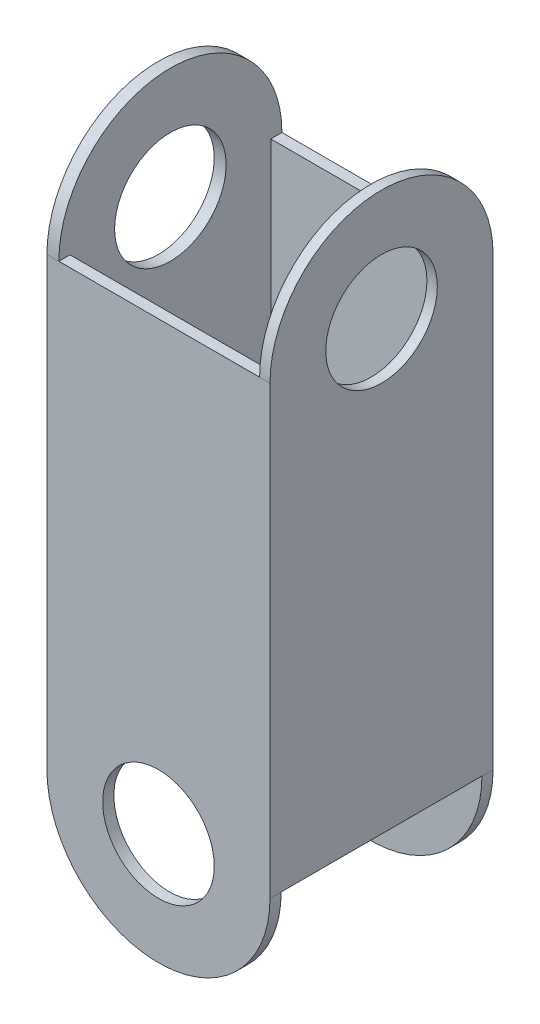
ISO-10303-21;
HEADER;
FILE_DESCRIPTION(('STEP AP214'),'2;1');
FILE_NAME('part.step','',(''),(''),'','','');
FILE_SCHEMA(('AUTOMOTIVE_DESIGN { 1 0 10303 214 1 1 1 1 }'));
ENDSEC;
DATA;
#1=APPLICATION_CONTEXT('core data for automotive mechanical design processes');
#2=APPLICATION_PROTOCOL_DEFINITION('international standard','automotive_design',2000,#1);
#3=PRODUCT_CONTEXT('',#1,'mechanical');
#4=PRODUCT('Part','Part','',(#3));
#5=PRODUCT_RELATED_PRODUCT_CATEGORY('part','',(#4));
#6=PRODUCT_DEFINITION_FORMATION('','',#4);
#7=PRODUCT_DEFINITION_CONTEXT('part definition',#1,'design');
#8=PRODUCT_DEFINITION('design','',#6,#7);
#9=PRODUCT_DEFINITION_SHAPE('','',#8);
#10=(LENGTH_UNIT() NAMED_UNIT(*) SI_UNIT(.MILLI.,.METRE.));
#11=(NAMED_UNIT(*) PLANE_ANGLE_UNIT() SI_UNIT($,.RADIAN.));
#12=(NAMED_UNIT(*) SI_UNIT($,.STERADIAN.) SOLID_ANGLE_UNIT());
#13=UNCERTAINTY_MEASURE_WITH_UNIT(LENGTH_MEASURE(1.E-05),#10,'distance_accuracy_value','');
#14=(GEOMETRIC_REPRESENTATION_CONTEXT(3) GLOBAL_UNCERTAINTY_ASSIGNED_CONTEXT((#13)) GLOBAL_UNIT_ASSIGNED_CONTEXT((#10,
#11,#12)) REPRESENTATION_CONTEXT('',''));
#15=CARTESIAN_POINT('',(0.,0.,0.));
#16=DIRECTION('',(0.,0.,1.));
#17=DIRECTION('',(1.,0.,0.));
#18=AXIS2_PLACEMENT_3D('',#15,#16,#17);
#19=CARTESIAN_POINT('',(20.,20.,10.));
#20=DIRECTION('',(0.,-1.,0.));
#21=DIRECTION('',(0.,0.,-1.));
#22=AXIS2_PLACEMENT_3D('',#19,#20,#21);
#23=PLANE('',#22);
#24=DIRECTION('',(0.,0.,-1.));
#25=VECTOR('',#24,1.);
#26=CARTESIAN_POINT('',(1.06806667440152,20.,10.));
#27=LINE('',#26,#25);
#28=CARTESIAN_POINT('',(1.06806667440152,20.,10.));
#29=VERTEX_POINT('',#28);
#30=CARTESIAN_POINT('',(1.06806667440152,20.,9.));
#31=VERTEX_POINT('',#30);
#32=EDGE_CURVE('E167',#29,#31,#27,.T.);
#33=ORIENTED_EDGE('',*,*,#32,.F.);
#34=DIRECTION('',(-1.,0.,0.));
#35=VECTOR('',#34,1.);
#36=CARTESIAN_POINT('',(20.,20.,10.));
#37=LINE('',#36,#35);
#38=CARTESIAN_POINT('',(19.0680666744015,20.,10.));
#39=VERTEX_POINT('',#38);
#40=EDGE_CURVE('E180',#39,#29,#37,.T.);
#41=ORIENTED_EDGE('',*,*,#40,.F.);
#42=DIRECTION('',(0.,0.,1.));
#43=VECTOR('',#42,1.);
#44=CARTESIAN_POINT('',(19.0680666744015,20.,10.));
#45=LINE('',#44,#43);
#46=CARTESIAN_POINT('',(19.0680666744015,20.,9.));
#47=VERTEX_POINT('',#46);
#48=EDGE_CURVE('E219',#47,#39,#45,.T.);
#49=ORIENTED_EDGE('',*,*,#48,.F.);
#50=DIRECTION('',(1.,0.,0.));
#51=VECTOR('',#50,1.);
#52=CARTESIAN_POINT('',(1.06806667440152,20.,9.));
#53=LINE('',#52,#51);
#54=EDGE_CURVE('E183',#31,#47,#53,.T.);
#55=ORIENTED_EDGE('',*,*,#54,.F.);
#56=EDGE_LOOP('',(#33,#41,#49,#55));
#57=FACE_BOUND('',#56,.T.);
#58=ADVANCED_FACE('F39',(#57),#23,.F.);
#59=CARTESIAN_POINT('',(1.06806667440152,20.,-9.));
#60=VERTEX_POINT('',#59);
#61=CARTESIAN_POINT('',(1.06806667440152,20.,-10.));
#62=VERTEX_POINT('',#61);
#63=EDGE_CURVE('E175',#60,#62,#27,.T.);
#64=ORIENTED_EDGE('',*,*,#63,.F.);
#65=DIRECTION('',(-1.,0.,0.));
#66=VECTOR('',#65,1.);
#67=CARTESIAN_POINT('',(1.06806667440152,20.,-9.));
#68=LINE('',#67,#66);
#69=CARTESIAN_POINT('',(19.0680666744015,20.,-9.));
#70=VERTEX_POINT('',#69);
#71=EDGE_CURVE('E223',#70,#60,#68,.T.);
#72=ORIENTED_EDGE('',*,*,#71,.F.);
#73=CARTESIAN_POINT('',(19.0680666744015,20.,-10.));
#74=VERTEX_POINT('',#73);
#75=EDGE_CURVE('E56',#74,#70,#45,.T.);
#76=ORIENTED_EDGE('',*,*,#75,.F.);
#77=DIRECTION('',(-1.,0.,0.));
#78=VECTOR('',#77,1.);
#79=CARTESIAN_POINT('',(20.,20.,-10.));
#80=LINE('',#79,#78);
#81=EDGE_CURVE('E48',#74,#62,#80,.T.);
#82=ORIENTED_EDGE('',*,*,#81,.T.);
#83=EDGE_LOOP('',(#64,#72,#76,#82));
#84=FACE_BOUND('',#83,.T.);
#85=ADVANCED_FACE('F362',(#84),#23,.F.);
#86=CARTESIAN_POINT('',(20.,-20.,10.));
#87=DIRECTION('',(0.,1.,0.));
#88=DIRECTION('',(0.,0.,1.));
#89=AXIS2_PLACEMENT_3D('',#86,#87,#88);
#90=PLANE('',#89);
#91=DIRECTION('',(-1.,0.,0.));
#92=VECTOR('',#91,1.);
#93=CARTESIAN_POINT('',(20.,-20.,-9.));
#94=LINE('',#93,#92);
#95=CARTESIAN_POINT('',(20.,-20.,-9.));
#96=VERTEX_POINT('',#95);
#97=CARTESIAN_POINT('',(18.9659666627992,-20.,-9.));
#98=VERTEX_POINT('',#97);
#99=EDGE_CURVE('E262',#96,#98,#94,.T.);
#100=ORIENTED_EDGE('',*,*,#99,.F.);
#101=DIRECTION('',(0.,0.,-1.));
#102=VECTOR('',#101,1.);
#103=CARTESIAN_POINT('',(20.,-20.,10.));
#104=LINE('',#103,#102);
#105=CARTESIAN_POINT('',(20.,-20.,9.));
#106=VERTEX_POINT('',#105);
#107=EDGE_CURVE('E191',#106,#96,#104,.T.);
#108=ORIENTED_EDGE('',*,*,#107,.F.);
#109=DIRECTION('',(1.,0.,0.));
#110=VECTOR('',#109,1.);
#111=CARTESIAN_POINT('',(20.,-20.,9.));
#112=LINE('',#111,#110);
#113=CARTESIAN_POINT('',(18.9659666627992,-20.,9.));
#114=VERTEX_POINT('',#113);
#115=EDGE_CURVE('E273',#114,#106,#112,.T.);
#116=ORIENTED_EDGE('',*,*,#115,.F.);
#117=DIRECTION('',(0.,0.,1.));
#118=VECTOR('',#117,1.);
#119=CARTESIAN_POINT('',(18.9659666627992,-20.,9.));
#120=LINE('',#119,#118);
#121=EDGE_CURVE('E279',#98,#114,#120,.T.);
#122=ORIENTED_EDGE('',*,*,#121,.F.);
#123=EDGE_LOOP('',(#100,#108,#116,#122));
#124=FACE_BOUND('',#123,.T.);
#125=ADVANCED_FACE('F333',(#124),#90,.F.);
#126=CARTESIAN_POINT('',(0.965966662799245,-20.,-9.));
#127=VERTEX_POINT('',#126);
#128=CARTESIAN_POINT('',(0.,-20.,-9.));
#129=VERTEX_POINT('',#128);
#130=EDGE_CURVE('E257',#127,#129,#94,.T.);
#131=ORIENTED_EDGE('',*,*,#130,.F.);
#132=DIRECTION('',(0.,0.,-1.));
#133=VECTOR('',#132,1.);
#134=CARTESIAN_POINT('',(0.965966662799243,-20.,9.));
#135=LINE('',#134,#133);
#136=CARTESIAN_POINT('',(0.965966662799243,-20.,9.));
#137=VERTEX_POINT('',#136);
#138=EDGE_CURVE('E284',#137,#127,#135,.T.);
#139=ORIENTED_EDGE('',*,*,#138,.F.);
#140=CARTESIAN_POINT('',(0.,-20.,9.));
#141=VERTEX_POINT('',#140);
#142=EDGE_CURVE('E276',#141,#137,#112,.T.);
#143=ORIENTED_EDGE('',*,*,#142,.F.);
#144=DIRECTION('',(0.,0.,-1.));
#145=VECTOR('',#144,1.);
#146=CARTESIAN_POINT('',(0.,-20.,10.));
#147=LINE('',#146,#145);
#148=EDGE_CURVE('E312',#141,#129,#147,.T.);
#149=ORIENTED_EDGE('',*,*,#148,.T.);
#150=EDGE_LOOP('',(#131,#139,#143,#149));
#151=FACE_BOUND('',#150,.T.);
#152=ADVANCED_FACE('F390',(#151),#90,.F.);
#153=CARTESIAN_POINT('',(20.,20.,-10.));
#154=DIRECTION('',(0.,0.,1.));
#155=DIRECTION('',(0.,-1.,0.));
#156=AXIS2_PLACEMENT_3D('',#153,#154,#155);
#157=PLANE('',#156);
#158=CARTESIAN_POINT('',(10.,-20.,-10.));
#159=DIRECTION('',(0.,0.,-1.));
#160=DIRECTION('',(0.,1.,0.));
#161=AXIS2_PLACEMENT_3D('',#158,#159,#160);
#162=CIRCLE('',#161,5.);
#163=CARTESIAN_POINT('',(10.,-15.,-10.));
#164=VERTEX_POINT('',#163);
#165=EDGE_CURVE('E242',#164,#164,#162,.T.);
#166=ORIENTED_EDGE('',*,*,#165,.F.);
#167=EDGE_LOOP('',(#166));
#168=FACE_BOUND('',#167,.T.);
#169=DIRECTION('',(0.,1.,0.));
#170=VECTOR('',#169,1.);
#171=CARTESIAN_POINT('',(20.,20.,-10.));
#172=LINE('',#171,#170);
#173=CARTESIAN_POINT('',(20.,-20.,-10.));
#174=VERTEX_POINT('',#173);
#175=CARTESIAN_POINT('',(20.,20.,-10.));
#176=VERTEX_POINT('',#175);
#177=EDGE_CURVE('E306',#174,#176,#172,.T.);
#178=ORIENTED_EDGE('',*,*,#177,.F.);
#179=CARTESIAN_POINT('',(10.,-20.,-10.));
#180=DIRECTION('',(0.,0.,-1.));
#181=DIRECTION('',(0.,1.,0.));
#182=AXIS2_PLACEMENT_3D('',#179,#180,#181);
#183=CIRCLE('',#182,10.);
#184=CARTESIAN_POINT('',(0.,-20.,-10.));
#185=VERTEX_POINT('',#184);
#186=EDGE_CURVE('E251',#174,#185,#183,.T.);
#187=ORIENTED_EDGE('',*,*,#186,.T.);
#188=DIRECTION('',(0.,1.,0.));
#189=VECTOR('',#188,1.);
#190=CARTESIAN_POINT('',(0.,20.,-10.));
#191=LINE('',#190,#189);
#192=CARTESIAN_POINT('',(0.,20.,-10.));
#193=VERTEX_POINT('',#192);
#194=EDGE_CURVE('E300',#185,#193,#191,.T.);
#195=ORIENTED_EDGE('',*,*,#194,.T.);
#196=DIRECTION('',(-1.,0.,0.));
#197=VECTOR('',#196,1.);
#198=CARTESIAN_POINT('',(1.06806667440152,20.,-10.));
#199=LINE('',#198,#197);
#200=EDGE_CURVE('E166',#62,#193,#199,.T.);
#201=ORIENTED_EDGE('',*,*,#200,.F.);
#202=ORIENTED_EDGE('',*,*,#81,.F.);
#203=EDGE_CURVE('E11',#176,#74,#80,.T.);
#204=ORIENTED_EDGE('',*,*,#203,.F.);
#205=EDGE_LOOP('',(#178,#187,#195,#201,#202,#204));
#206=FACE_BOUND('',#205,.T.);
#207=ADVANCED_FACE('F41',(#168,#206),#157,.F.);
#208=CARTESIAN_POINT('',(20.,20.,10.));
#209=DIRECTION('',(0.,0.,-1.));
#210=DIRECTION('',(0.,1.,0.));
#211=AXIS2_PLACEMENT_3D('',#208,#209,#210);
#212=PLANE('',#211);
#213=CARTESIAN_POINT('',(10.,-20.,10.));
#214=DIRECTION('',(0.,0.,1.));
#215=DIRECTION('',(1.,0.,0.));
#216=AXIS2_PLACEMENT_3D('',#213,#214,#215);
#217=CIRCLE('',#216,5.);
#218=CARTESIAN_POINT('',(15.,-20.,10.));
#219=VERTEX_POINT('',#218);
#220=EDGE_CURVE('E207',#219,#219,#217,.T.);
#221=ORIENTED_EDGE('',*,*,#220,.F.);
#222=EDGE_LOOP('',(#221));
#223=FACE_BOUND('',#222,.T.);
#224=DIRECTION('',(0.,-1.,0.));
#225=VECTOR('',#224,1.);
#226=CARTESIAN_POINT('',(0.,20.,10.));
#227=LINE('',#226,#225);
#228=CARTESIAN_POINT('',(0.,20.,10.));
#229=VERTEX_POINT('',#228);
#230=CARTESIAN_POINT('',(0.,-20.,10.));
#231=VERTEX_POINT('',#230);
#232=EDGE_CURVE('E311',#229,#231,#227,.T.);
#233=ORIENTED_EDGE('',*,*,#232,.T.);
#234=CARTESIAN_POINT('',(10.,-20.,10.));
#235=DIRECTION('',(0.,0.,1.));
#236=DIRECTION('',(1.,0.,0.));
#237=AXIS2_PLACEMENT_3D('',#234,#235,#236);
#238=CIRCLE('',#237,10.);
#239=CARTESIAN_POINT('',(20.,-20.,10.));
#240=VERTEX_POINT('',#239);
#241=EDGE_CURVE('E269',#231,#240,#238,.T.);
#242=ORIENTED_EDGE('',*,*,#241,.T.);
#243=DIRECTION('',(0.,-1.,0.));
#244=VECTOR('',#243,1.);
#245=CARTESIAN_POINT('',(20.,20.,10.));
#246=LINE('',#245,#244);
#247=CARTESIAN_POINT('',(20.,20.,10.));
#248=VERTEX_POINT('',#247);
#249=EDGE_CURVE('E308',#248,#240,#246,.T.);
#250=ORIENTED_EDGE('',*,*,#249,.F.);
#251=EDGE_CURVE('E187',#248,#39,#37,.T.);
#252=ORIENTED_EDGE('',*,*,#251,.T.);
#253=ORIENTED_EDGE('',*,*,#40,.T.);
#254=DIRECTION('',(-1.,0.,0.));
#255=VECTOR('',#254,1.);
#256=CARTESIAN_POINT('',(1.06806667440152,20.,10.));
#257=LINE('',#256,#255);
#258=EDGE_CURVE('E156',#29,#229,#257,.T.);
#259=ORIENTED_EDGE('',*,*,#258,.T.);
#260=EDGE_LOOP('',(#233,#242,#250,#252,#253,#259));
#261=FACE_BOUND('',#260,.T.);
#262=ADVANCED_FACE('F185',(#223,#261),#212,.F.);
#263=CARTESIAN_POINT('',(20.,0.,0.));
#264=DIRECTION('',(1.,0.,0.));
#265=DIRECTION('',(0.,0.,-1.));
#266=AXIS2_PLACEMENT_3D('',#263,#264,#265);
#267=PLANE('',#266);
#268=CARTESIAN_POINT('',(20.,20.,0.));
#269=DIRECTION('',(1.,0.,0.));
#270=DIRECTION('',(0.,0.,-1.));
#271=AXIS2_PLACEMENT_3D('',#268,#269,#270);
#272=CIRCLE('',#271,5.);
#273=CARTESIAN_POINT('',(20.,20.,-5.));
#274=VERTEX_POINT('',#273);
#275=EDGE_CURVE('E211',#274,#274,#272,.T.);
#276=ORIENTED_EDGE('',*,*,#275,.F.);
#277=EDGE_LOOP('',(#276));
#278=FACE_BOUND('',#277,.T.);
#279=ORIENTED_EDGE('',*,*,#177,.T.);
#280=CARTESIAN_POINT('',(20.,20.,0.));
#281=DIRECTION('',(1.,0.,0.));
#282=DIRECTION('',(0.,0.,-1.));
#283=AXIS2_PLACEMENT_3D('',#280,#281,#282);
#284=CIRCLE('',#283,10.);
#285=EDGE_CURVE('E215',#176,#248,#284,.T.);
#286=ORIENTED_EDGE('',*,*,#285,.T.);
#287=ORIENTED_EDGE('',*,*,#249,.T.);
#288=EDGE_CURVE('E188',#240,#106,#104,.T.);
#289=ORIENTED_EDGE('',*,*,#288,.T.);
#290=ORIENTED_EDGE('',*,*,#107,.T.);
#291=DIRECTION('',(0.,0.,-1.));
#292=VECTOR('',#291,1.);
#293=CARTESIAN_POINT('',(20.,-20.,-9.));
#294=LINE('',#293,#292);
#295=EDGE_CURVE('E266',#96,#174,#294,.T.);
#296=ORIENTED_EDGE('',*,*,#295,.T.);
#297=EDGE_LOOP('',(#279,#286,#287,#289,#290,#296));
#298=FACE_BOUND('',#297,.T.);
#299=ADVANCED_FACE('F344',(#278,#298),#267,.T.);
#300=CARTESIAN_POINT('',(0.,0.,0.));
#301=DIRECTION('',(1.,0.,0.));
#302=DIRECTION('',(0.,0.,-1.));
#303=AXIS2_PLACEMENT_3D('',#300,#301,#302);
#304=PLANE('',#303);
#305=CARTESIAN_POINT('',(0.,20.,0.));
#306=DIRECTION('',(-1.,0.,0.));
#307=DIRECTION('',(0.,0.,1.));
#308=AXIS2_PLACEMENT_3D('',#305,#306,#307);
#309=CIRCLE('',#308,5.);
#310=CARTESIAN_POINT('',(0.,20.,5.));
#311=VERTEX_POINT('',#310);
#312=EDGE_CURVE('E198',#311,#311,#309,.T.);
#313=ORIENTED_EDGE('',*,*,#312,.F.);
#314=EDGE_LOOP('',(#313));
#315=FACE_BOUND('',#314,.T.);
#316=ORIENTED_EDGE('',*,*,#232,.F.);
#317=CARTESIAN_POINT('',(0.,20.,0.));
#318=DIRECTION('',(-1.,0.,0.));
#319=DIRECTION('',(0.,0.,1.));
#320=AXIS2_PLACEMENT_3D('',#317,#318,#319);
#321=CIRCLE('',#320,10.);
#322=EDGE_CURVE('E162',#229,#193,#321,.T.);
#323=ORIENTED_EDGE('',*,*,#322,.T.);
#324=ORIENTED_EDGE('',*,*,#194,.F.);
#325=DIRECTION('',(0.,0.,-1.));
#326=VECTOR('',#325,1.);
#327=CARTESIAN_POINT('',(0.,-20.,-9.));
#328=LINE('',#327,#326);
#329=EDGE_CURVE('E263',#129,#185,#328,.T.);
#330=ORIENTED_EDGE('',*,*,#329,.F.);
#331=ORIENTED_EDGE('',*,*,#148,.F.);
#332=EDGE_CURVE('E194',#231,#141,#147,.T.);
#333=ORIENTED_EDGE('',*,*,#332,.F.);
#334=EDGE_LOOP('',(#316,#323,#324,#330,#331,#333));
#335=FACE_BOUND('',#334,.T.);
#336=ADVANCED_FACE('F363',(#315,#335),#304,.F.);
#337=CARTESIAN_POINT('',(18.9659666627992,0.,9.));
#338=DIRECTION('',(1.,0.,0.));
#339=DIRECTION('',(0.,0.,-1.));
#340=AXIS2_PLACEMENT_3D('',#337,#338,#339);
#341=PLANE('',#340);
#342=ORIENTED_EDGE('',*,*,#121,.T.);
#343=DIRECTION('',(0.,-1.,0.));
#344=VECTOR('',#343,1.);
#345=CARTESIAN_POINT('',(18.9659666627992,0.,9.));
#346=LINE('',#345,#344);
#347=CARTESIAN_POINT('',(18.9659666627992,0.,9.));
#348=VERTEX_POINT('',#347);
#349=EDGE_CURVE('E293',#348,#114,#346,.T.);
#350=ORIENTED_EDGE('',*,*,#349,.F.);
#351=DIRECTION('',(0.,0.,1.));
#352=VECTOR('',#351,1.);
#353=CARTESIAN_POINT('',(18.9659666627992,0.,9.));
#354=LINE('',#353,#352);
#355=CARTESIAN_POINT('',(18.9659666627992,0.,-9.));
#356=VERTEX_POINT('',#355);
#357=EDGE_CURVE('E280',#356,#348,#354,.T.);
#358=ORIENTED_EDGE('',*,*,#357,.F.);
#359=DIRECTION('',(0.,-1.,0.));
#360=VECTOR('',#359,1.);
#361=CARTESIAN_POINT('',(18.9659666627992,0.,-9.));
#362=LINE('',#361,#360);
#363=EDGE_CURVE('E298',#356,#98,#362,.T.);
#364=ORIENTED_EDGE('',*,*,#363,.T.);
#365=EDGE_LOOP('',(#342,#350,#358,#364));
#366=FACE_BOUND('',#365,.T.);
#367=ADVANCED_FACE('F336',(#366),#341,.F.);
#368=CARTESIAN_POINT('',(0.965966662799245,0.,-9.));
#369=DIRECTION('',(0.,0.,-1.));
#370=DIRECTION('',(-1.,0.,0.));
#371=AXIS2_PLACEMENT_3D('',#368,#369,#370);
#372=PLANE('',#371);
#373=CARTESIAN_POINT('',(10.,-20.,-9.));
#374=DIRECTION('',(0.,0.,-1.));
#375=DIRECTION('',(0.,1.,0.));
#376=AXIS2_PLACEMENT_3D('',#373,#374,#375);
#377=CIRCLE('',#376,5.);
#378=CARTESIAN_POINT('',(10.,-15.,-9.));
#379=VERTEX_POINT('',#378);
#380=EDGE_CURVE('E248',#379,#379,#377,.T.);
#381=ORIENTED_EDGE('',*,*,#380,.T.);
#382=EDGE_LOOP('',(#381));
#383=FACE_BOUND('',#382,.T.);
#384=DIRECTION('',(0.,-1.,0.));
#385=VECTOR('',#384,1.);
#386=CARTESIAN_POINT('',(0.965966662799245,0.,-9.));
#387=LINE('',#386,#385);
#388=CARTESIAN_POINT('',(0.965966662799245,0.,-9.));
#389=VERTEX_POINT('',#388);
#390=EDGE_CURVE('E301',#389,#127,#387,.T.);
#391=ORIENTED_EDGE('',*,*,#390,.T.);
#392=ORIENTED_EDGE('',*,*,#130,.T.);
#393=CARTESIAN_POINT('',(10.,-20.,-9.));
#394=DIRECTION('',(0.,0.,-1.));
#395=DIRECTION('',(0.,1.,0.));
#396=AXIS2_PLACEMENT_3D('',#393,#394,#395);
#397=CIRCLE('',#396,10.);
#398=EDGE_CURVE('E254',#96,#129,#397,.T.);
#399=ORIENTED_EDGE('',*,*,#398,.F.);
#400=ORIENTED_EDGE('',*,*,#99,.T.);
#401=ORIENTED_EDGE('',*,*,#363,.F.);
#402=DIRECTION('',(1.,0.,0.));
#403=VECTOR('',#402,1.);
#404=CARTESIAN_POINT('',(0.965966662799245,0.,-9.));
#405=LINE('',#404,#403);
#406=EDGE_CURVE('E290',#389,#356,#405,.T.);
#407=ORIENTED_EDGE('',*,*,#406,.F.);
#408=EDGE_LOOP('',(#391,#392,#399,#400,#401,#407));
#409=FACE_BOUND('',#408,.T.);
#410=ADVANCED_FACE('F342',(#383,#409),#372,.F.);
#411=CARTESIAN_POINT('',(0.965966662799243,0.,9.));
#412=DIRECTION('',(-1.,0.,0.));
#413=DIRECTION('',(0.,0.,1.));
#414=AXIS2_PLACEMENT_3D('',#411,#412,#413);
#415=PLANE('',#414);
#416=ORIENTED_EDGE('',*,*,#138,.T.);
#417=ORIENTED_EDGE('',*,*,#390,.F.);
#418=DIRECTION('',(0.,0.,-1.));
#419=VECTOR('',#418,1.);
#420=CARTESIAN_POINT('',(0.965966662799243,0.,9.));
#421=LINE('',#420,#419);
#422=CARTESIAN_POINT('',(0.965966662799243,0.,9.));
#423=VERTEX_POINT('',#422);
#424=EDGE_CURVE('E287',#423,#389,#421,.T.);
#425=ORIENTED_EDGE('',*,*,#424,.F.);
#426=DIRECTION('',(0.,-1.,0.));
#427=VECTOR('',#426,1.);
#428=CARTESIAN_POINT('',(0.965966662799243,0.,9.));
#429=LINE('',#428,#427);
#430=EDGE_CURVE('E303',#423,#137,#429,.T.);
#431=ORIENTED_EDGE('',*,*,#430,.T.);
#432=EDGE_LOOP('',(#416,#417,#425,#431));
#433=FACE_BOUND('',#432,.T.);
#434=ADVANCED_FACE('F401',(#433),#415,.F.);
#435=CARTESIAN_POINT('',(0.965966662799243,0.,9.));
#436=DIRECTION('',(0.,0.,1.));
#437=DIRECTION('',(1.,0.,0.));
#438=AXIS2_PLACEMENT_3D('',#435,#436,#437);
#439=PLANE('',#438);
#440=CARTESIAN_POINT('',(10.,-20.,8.99999999999999));
#441=DIRECTION('',(0.,0.,1.));
#442=DIRECTION('',(1.,0.,0.));
#443=AXIS2_PLACEMENT_3D('',#440,#441,#442);
#444=CIRCLE('',#443,5.);
#445=CARTESIAN_POINT('',(15.,-20.,8.99999999999999));
#446=VERTEX_POINT('',#445);
#447=EDGE_CURVE('E43',#446,#446,#444,.T.);
#448=ORIENTED_EDGE('',*,*,#447,.T.);
#449=EDGE_LOOP('',(#448));
#450=FACE_BOUND('',#449,.T.);
#451=ORIENTED_EDGE('',*,*,#349,.T.);
#452=ORIENTED_EDGE('',*,*,#115,.T.);
#453=CARTESIAN_POINT('',(10.,-20.,9.));
#454=DIRECTION('',(0.,0.,1.));
#455=DIRECTION('',(1.,0.,0.));
#456=AXIS2_PLACEMENT_3D('',#453,#454,#455);
#457=CIRCLE('',#456,10.);
#458=EDGE_CURVE('E270',#141,#106,#457,.T.);
#459=ORIENTED_EDGE('',*,*,#458,.F.);
#460=ORIENTED_EDGE('',*,*,#142,.T.);
#461=ORIENTED_EDGE('',*,*,#430,.F.);
#462=DIRECTION('',(-1.,0.,0.));
#463=VECTOR('',#462,1.);
#464=CARTESIAN_POINT('',(0.965966662799243,0.,9.));
#465=LINE('',#464,#463);
#466=EDGE_CURVE('E283',#348,#423,#465,.T.);
#467=ORIENTED_EDGE('',*,*,#466,.F.);
#468=EDGE_LOOP('',(#451,#452,#459,#460,#461,#467));
#469=FACE_BOUND('',#468,.T.);
#470=ADVANCED_FACE('F327',(#450,#469),#439,.F.);
#471=CARTESIAN_POINT('',(0.,0.,0.));
#472=DIRECTION('',(0.,-1.,0.));
#473=DIRECTION('',(0.,0.,-1.));
#474=AXIS2_PLACEMENT_3D('',#471,#472,#473);
#475=PLANE('',#474);
#476=ORIENTED_EDGE('',*,*,#357,.T.);
#477=ORIENTED_EDGE('',*,*,#466,.T.);
#478=ORIENTED_EDGE('',*,*,#424,.T.);
#479=ORIENTED_EDGE('',*,*,#406,.T.);
#480=EDGE_LOOP('',(#476,#477,#478,#479));
#481=FACE_BOUND('',#480,.T.);
#482=ADVANCED_FACE('F377',(#481),#475,.T.);
#483=CARTESIAN_POINT('',(10.,-20.,9.));
#484=DIRECTION('',(0.,0.,1.));
#485=DIRECTION('',(1.,0.,0.));
#486=AXIS2_PLACEMENT_3D('',#483,#484,#485);
#487=CYLINDRICAL_SURFACE('',#486,10.);
#488=ORIENTED_EDGE('',*,*,#458,.T.);
#489=ORIENTED_EDGE('',*,*,#288,.F.);
#490=ORIENTED_EDGE('',*,*,#241,.F.);
#491=ORIENTED_EDGE('',*,*,#332,.T.);
#492=EDGE_LOOP('',(#488,#489,#490,#491));
#493=FACE_BOUND('',#492,.T.);
#494=ADVANCED_FACE('F322',(#493),#487,.T.);
#495=CARTESIAN_POINT('',(10.,-20.,-9.));
#496=DIRECTION('',(0.,0.,-1.));
#497=DIRECTION('',(0.,1.,0.));
#498=AXIS2_PLACEMENT_3D('',#495,#496,#497);
#499=CYLINDRICAL_SURFACE('',#498,10.);
#500=ORIENTED_EDGE('',*,*,#295,.F.);
#501=ORIENTED_EDGE('',*,*,#398,.T.);
#502=ORIENTED_EDGE('',*,*,#329,.T.);
#503=ORIENTED_EDGE('',*,*,#186,.F.);
#504=EDGE_LOOP('',(#500,#501,#502,#503));
#505=FACE_BOUND('',#504,.T.);
#506=ADVANCED_FACE('F365',(#505),#499,.T.);
#507=CARTESIAN_POINT('',(10.,-20.,-9.));
#508=DIRECTION('',(0.,0.,-1.));
#509=DIRECTION('',(0.,1.,0.));
#510=AXIS2_PLACEMENT_3D('',#507,#508,#509);
#511=CYLINDRICAL_SURFACE('',#510,5.);
#512=ORIENTED_EDGE('',*,*,#380,.F.);
#513=EDGE_LOOP('',(#512));
#514=FACE_BOUND('',#513,.T.);
#515=ORIENTED_EDGE('',*,*,#165,.T.);
#516=EDGE_LOOP('',(#515));
#517=FACE_BOUND('',#516,.T.);
#518=ADVANCED_FACE('F367',(#514,#517),#511,.F.);
#519=CARTESIAN_POINT('',(19.0680666744015,2.00000000000001,-9.));
#520=DIRECTION('',(1.,0.,0.));
#521=DIRECTION('',(0.,0.,-1.));
#522=AXIS2_PLACEMENT_3D('',#519,#520,#521);
#523=PLANE('',#522);
#524=CARTESIAN_POINT('',(19.0680666744015,20.,0.));
#525=DIRECTION('',(1.,0.,0.));
#526=DIRECTION('',(0.,0.,-1.));
#527=AXIS2_PLACEMENT_3D('',#524,#525,#526);
#528=CIRCLE('',#527,5.);
#529=CARTESIAN_POINT('',(19.0680666744015,20.,-5.));
#530=VERTEX_POINT('',#529);
#531=EDGE_CURVE('E212',#530,#530,#528,.T.);
#532=ORIENTED_EDGE('',*,*,#531,.T.);
#533=EDGE_LOOP('',(#532));
#534=FACE_BOUND('',#533,.T.);
#535=DIRECTION('',(0.,1.,0.));
#536=VECTOR('',#535,1.);
#537=CARTESIAN_POINT('',(19.0680666744015,2.00000000000001,9.));
#538=LINE('',#537,#536);
#539=CARTESIAN_POINT('',(19.0680666744015,2.00000000000001,9.));
#540=VERTEX_POINT('',#539);
#541=EDGE_CURVE('E240',#540,#47,#538,.T.);
#542=ORIENTED_EDGE('',*,*,#541,.T.);
#543=ORIENTED_EDGE('',*,*,#48,.T.);
#544=CARTESIAN_POINT('',(19.0680666744015,20.,0.));
#545=DIRECTION('',(1.,0.,0.));
#546=DIRECTION('',(0.,0.,-1.));
#547=AXIS2_PLACEMENT_3D('',#544,#545,#546);
#548=CIRCLE('',#547,10.);
#549=EDGE_CURVE('E63',#74,#39,#548,.T.);
#550=ORIENTED_EDGE('',*,*,#549,.F.);
#551=ORIENTED_EDGE('',*,*,#75,.T.);
#552=DIRECTION('',(0.,1.,0.));
#553=VECTOR('',#552,1.);
#554=CARTESIAN_POINT('',(19.0680666744015,2.00000000000001,-9.));
#555=LINE('',#554,#553);
#556=CARTESIAN_POINT('',(19.0680666744015,2.00000000000001,-9.));
#557=VERTEX_POINT('',#556);
#558=EDGE_CURVE('E236',#557,#70,#555,.T.);
#559=ORIENTED_EDGE('',*,*,#558,.F.);
#560=DIRECTION('',(0.,0.,-1.));
#561=VECTOR('',#560,1.);
#562=CARTESIAN_POINT('',(19.0680666744015,2.00000000000001,-9.));
#563=LINE('',#562,#561);
#564=EDGE_CURVE('E224',#540,#557,#563,.T.);
#565=ORIENTED_EDGE('',*,*,#564,.F.);
#566=EDGE_LOOP('',(#542,#543,#550,#551,#559,#565));
#567=FACE_BOUND('',#566,.T.);
#568=ADVANCED_FACE('F351',(#534,#567),#523,.F.);
#569=CARTESIAN_POINT('',(1.06806667440152,2.00000000000001,9.));
#570=DIRECTION('',(0.,0.,1.));
#571=DIRECTION('',(0.,-1.,0.));
#572=AXIS2_PLACEMENT_3D('',#569,#570,#571);
#573=PLANE('',#572);
#574=ORIENTED_EDGE('',*,*,#54,.T.);
#575=ORIENTED_EDGE('',*,*,#541,.F.);
#576=DIRECTION('',(1.,0.,0.));
#577=VECTOR('',#576,1.);
#578=CARTESIAN_POINT('',(1.06806667440152,2.00000000000001,9.));
#579=LINE('',#578,#577);
#580=CARTESIAN_POINT('',(1.06806667440152,2.00000000000001,9.));
#581=VERTEX_POINT('',#580);
#582=EDGE_CURVE('E233',#581,#540,#579,.T.);
#583=ORIENTED_EDGE('',*,*,#582,.F.);
#584=DIRECTION('',(0.,1.,0.));
#585=VECTOR('',#584,1.);
#586=CARTESIAN_POINT('',(1.06806667440152,2.00000000000001,9.));
#587=LINE('',#586,#585);
#588=EDGE_CURVE('E243',#581,#31,#587,.T.);
#589=ORIENTED_EDGE('',*,*,#588,.T.);
#590=EDGE_LOOP('',(#574,#575,#583,#589));
#591=FACE_BOUND('',#590,.T.);
#592=ADVANCED_FACE('F354',(#591),#573,.F.);
#593=CARTESIAN_POINT('',(1.06806667440152,2.00000000000001,-9.));
#594=DIRECTION('',(-1.,0.,0.));
#595=DIRECTION('',(0.,0.,1.));
#596=AXIS2_PLACEMENT_3D('',#593,#594,#595);
#597=PLANE('',#596);
#598=CARTESIAN_POINT('',(1.06806667440151,20.,0.));
#599=DIRECTION('',(-1.,0.,0.));
#600=DIRECTION('',(0.,0.,1.));
#601=AXIS2_PLACEMENT_3D('',#598,#599,#600);
#602=CIRCLE('',#601,5.);
#603=CARTESIAN_POINT('',(1.06806667440151,20.,5.));
#604=VERTEX_POINT('',#603);
#605=EDGE_CURVE('E196',#604,#604,#602,.T.);
#606=ORIENTED_EDGE('',*,*,#605,.T.);
#607=EDGE_LOOP('',(#606));
#608=FACE_BOUND('',#607,.T.);
#609=DIRECTION('',(0.,1.,0.));
#610=VECTOR('',#609,1.);
#611=CARTESIAN_POINT('',(1.06806667440152,2.00000000000001,-9.));
#612=LINE('',#611,#610);
#613=CARTESIAN_POINT('',(1.06806667440152,2.00000000000001,-9.));
#614=VERTEX_POINT('',#613);
#615=EDGE_CURVE('E245',#614,#60,#612,.T.);
#616=ORIENTED_EDGE('',*,*,#615,.T.);
#617=ORIENTED_EDGE('',*,*,#63,.T.);
#618=CARTESIAN_POINT('',(1.06806667440152,20.,0.));
#619=DIRECTION('',(-1.,0.,0.));
#620=DIRECTION('',(0.,0.,1.));
#621=AXIS2_PLACEMENT_3D('',#618,#619,#620);
#622=CIRCLE('',#621,10.);
#623=EDGE_CURVE('E159',#29,#62,#622,.T.);
#624=ORIENTED_EDGE('',*,*,#623,.F.);
#625=ORIENTED_EDGE('',*,*,#32,.T.);
#626=ORIENTED_EDGE('',*,*,#588,.F.);
#627=DIRECTION('',(0.,0.,1.));
#628=VECTOR('',#627,1.);
#629=CARTESIAN_POINT('',(1.06806667440152,2.00000000000001,-9.));
#630=LINE('',#629,#628);
#631=EDGE_CURVE('E230',#614,#581,#630,.T.);
#632=ORIENTED_EDGE('',*,*,#631,.F.);
#633=EDGE_LOOP('',(#616,#617,#624,#625,#626,#632));
#634=FACE_BOUND('',#633,.T.);
#635=ADVANCED_FACE('F172',(#608,#634),#597,.F.);
#636=CARTESIAN_POINT('',(1.06806667440152,2.00000000000001,-9.));
#637=DIRECTION('',(0.,0.,-1.));
#638=DIRECTION('',(0.,1.,0.));
#639=AXIS2_PLACEMENT_3D('',#636,#637,#638);
#640=PLANE('',#639);
#641=ORIENTED_EDGE('',*,*,#71,.T.);
#642=ORIENTED_EDGE('',*,*,#615,.F.);
#643=DIRECTION('',(-1.,0.,0.));
#644=VECTOR('',#643,1.);
#645=CARTESIAN_POINT('',(1.06806667440152,2.00000000000001,-9.));
#646=LINE('',#645,#644);
#647=EDGE_CURVE('E227',#557,#614,#646,.T.);
#648=ORIENTED_EDGE('',*,*,#647,.F.);
#649=ORIENTED_EDGE('',*,*,#558,.T.);
#650=EDGE_LOOP('',(#641,#642,#648,#649));
#651=FACE_BOUND('',#650,.T.);
#652=ADVANCED_FACE('F361',(#651),#640,.F.);
#653=CARTESIAN_POINT('',(0.,2.00000000000001,0.));
#654=DIRECTION('',(0.,1.,0.));
#655=DIRECTION('',(0.,0.,1.));
#656=AXIS2_PLACEMENT_3D('',#653,#654,#655);
#657=PLANE('',#656);
#658=ORIENTED_EDGE('',*,*,#564,.T.);
#659=ORIENTED_EDGE('',*,*,#647,.T.);
#660=ORIENTED_EDGE('',*,*,#631,.T.);
#661=ORIENTED_EDGE('',*,*,#582,.T.);
#662=EDGE_LOOP('',(#658,#659,#660,#661));
#663=FACE_BOUND('',#662,.T.);
#664=ADVANCED_FACE('F358',(#663),#657,.T.);
#665=CARTESIAN_POINT('',(19.0680666744015,20.,0.));
#666=DIRECTION('',(1.,0.,0.));
#667=DIRECTION('',(0.,0.,-1.));
#668=AXIS2_PLACEMENT_3D('',#665,#666,#667);
#669=CYLINDRICAL_SURFACE('',#668,10.);
#670=ORIENTED_EDGE('',*,*,#203,.T.);
#671=ORIENTED_EDGE('',*,*,#549,.T.);
#672=ORIENTED_EDGE('',*,*,#251,.F.);
#673=ORIENTED_EDGE('',*,*,#285,.F.);
#674=EDGE_LOOP('',(#670,#671,#672,#673));
#675=FACE_BOUND('',#674,.T.);
#676=ADVANCED_FACE('F348',(#675),#669,.T.);
#677=CARTESIAN_POINT('',(19.0680666744015,20.,0.));
#678=DIRECTION('',(1.,0.,0.));
#679=DIRECTION('',(0.,0.,-1.));
#680=AXIS2_PLACEMENT_3D('',#677,#678,#679);
#681=CYLINDRICAL_SURFACE('',#680,5.);
#682=ORIENTED_EDGE('',*,*,#531,.F.);
#683=EDGE_LOOP('',(#682));
#684=FACE_BOUND('',#683,.T.);
#685=ORIENTED_EDGE('',*,*,#275,.T.);
#686=EDGE_LOOP('',(#685));
#687=FACE_BOUND('',#686,.T.);
#688=ADVANCED_FACE('F473',(#684,#687),#681,.F.);
#689=CARTESIAN_POINT('',(1.06806667440152,20.,0.));
#690=DIRECTION('',(-1.,0.,0.));
#691=DIRECTION('',(0.,0.,1.));
#692=AXIS2_PLACEMENT_3D('',#689,#690,#691);
#693=CYLINDRICAL_SURFACE('',#692,10.);
#694=ORIENTED_EDGE('',*,*,#623,.T.);
#695=ORIENTED_EDGE('',*,*,#200,.T.);
#696=ORIENTED_EDGE('',*,*,#322,.F.);
#697=ORIENTED_EDGE('',*,*,#258,.F.);
#698=EDGE_LOOP('',(#694,#695,#696,#697));
#699=FACE_BOUND('',#698,.T.);
#700=ADVANCED_FACE('F158',(#699),#693,.T.);
#701=CARTESIAN_POINT('',(20.,20.,0.));
#702=DIRECTION('',(-1.,0.,0.));
#703=DIRECTION('',(0.,0.,1.));
#704=AXIS2_PLACEMENT_3D('',#701,#702,#703);
#705=CYLINDRICAL_SURFACE('',#704,5.);
#706=ORIENTED_EDGE('',*,*,#312,.T.);
#707=EDGE_LOOP('',(#706));
#708=FACE_BOUND('',#707,.T.);
#709=ORIENTED_EDGE('',*,*,#605,.F.);
#710=EDGE_LOOP('',(#709));
#711=FACE_BOUND('',#710,.T.);
#712=ADVANCED_FACE('F429',(#708,#711),#705,.F.);
#713=CARTESIAN_POINT('',(10.,-20.,-10.));
#714=DIRECTION('',(0.,0.,1.));
#715=DIRECTION('',(1.,0.,0.));
#716=AXIS2_PLACEMENT_3D('',#713,#714,#715);
#717=CYLINDRICAL_SURFACE('',#716,5.);
#718=ORIENTED_EDGE('',*,*,#220,.T.);
#719=EDGE_LOOP('',(#718));
#720=FACE_BOUND('',#719,.T.);
#721=ORIENTED_EDGE('',*,*,#447,.F.);
#722=EDGE_LOOP('',(#721));
#723=FACE_BOUND('',#722,.T.);
#724=ADVANCED_FACE('F455',(#720,#723),#717,.F.);
#725=CLOSED_SHELL('',(#58,#85,#125,#152,#207,#262,#299,#336,#367,#410,#434,#470,#482,#494,#506,
#518,#568,#592,#635,#652,#664,#676,#688,#700,#712,#724));
#726=MANIFOLD_SOLID_BREP('B2',#725);
#727=ADVANCED_BREP_SHAPE_REPRESENTATION('',(#18,#726),#14);
#728=SHAPE_DEFINITION_REPRESENTATION(#9,#727);
ENDSEC;
END-ISO-10303-21;
